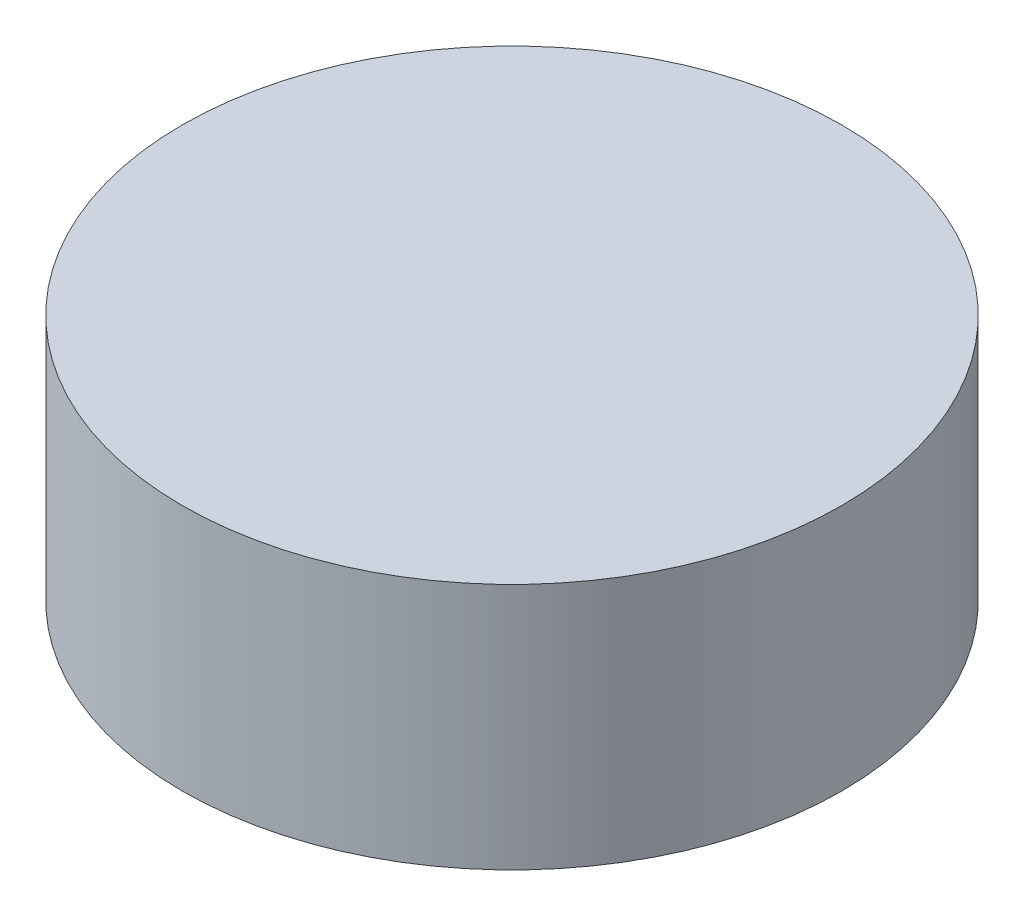
ISO-10303-21;
HEADER;
FILE_DESCRIPTION(('STEP AP214'),'2;1');
FILE_NAME('part.step','',(''),(''),'','','');
FILE_SCHEMA(('AUTOMOTIVE_DESIGN { 1 0 10303 214 1 1 1 1 }'));
ENDSEC;
DATA;
#1=APPLICATION_CONTEXT('core data for automotive mechanical design processes');
#2=APPLICATION_PROTOCOL_DEFINITION('international standard','automotive_design',2000,#1);
#3=PRODUCT_CONTEXT('',#1,'mechanical');
#4=PRODUCT('Part','Part','',(#3));
#5=PRODUCT_RELATED_PRODUCT_CATEGORY('part','',(#4));
#6=PRODUCT_DEFINITION_FORMATION('','',#4);
#7=PRODUCT_DEFINITION_CONTEXT('part definition',#1,'design');
#8=PRODUCT_DEFINITION('design','',#6,#7);
#9=PRODUCT_DEFINITION_SHAPE('','',#8);
#10=(LENGTH_UNIT() NAMED_UNIT(*) SI_UNIT(.MILLI.,.METRE.));
#11=(NAMED_UNIT(*) PLANE_ANGLE_UNIT() SI_UNIT($,.RADIAN.));
#12=(NAMED_UNIT(*) SI_UNIT($,.STERADIAN.) SOLID_ANGLE_UNIT());
#13=UNCERTAINTY_MEASURE_WITH_UNIT(LENGTH_MEASURE(1.E-05),#10,'distance_accuracy_value','');
#14=(GEOMETRIC_REPRESENTATION_CONTEXT(3) GLOBAL_UNCERTAINTY_ASSIGNED_CONTEXT((#13)) GLOBAL_UNIT_ASSIGNED_CONTEXT((#10,
#11,#12)) REPRESENTATION_CONTEXT('',''));
#15=CARTESIAN_POINT('',(0.,0.,0.));
#16=DIRECTION('',(0.,0.,1.));
#17=DIRECTION('',(1.,0.,0.));
#18=AXIS2_PLACEMENT_3D('',#15,#16,#17);
#19=CARTESIAN_POINT('',(-70.,-300.,999.189515242654));
#20=DIRECTION('',(0.,-1.,0.));
#21=DIRECTION('',(1.,0.,0.));
#22=AXIS2_PLACEMENT_3D('',#19,#20,#21);
#23=PLANE('',#22);
#24=CARTESIAN_POINT('',(-70.,-300.,999.189515242654));
#25=DIRECTION('',(0.,-1.,0.));
#26=DIRECTION('',(1.,0.,0.));
#27=AXIS2_PLACEMENT_3D('',#24,#25,#26);
#28=CIRCLE('',#27,40.);
#29=CARTESIAN_POINT('',(-30.,-300.,999.189515242654));
#30=VERTEX_POINT('',#29);
#31=EDGE_CURVE('E38',#30,#30,#28,.T.);
#32=ORIENTED_EDGE('',*,*,#31,.T.);
#33=EDGE_LOOP('',(#32));
#34=FACE_BOUND('',#33,.T.);
#35=CARTESIAN_POINT('',(-70.,-300.,999.189515242654));
#36=DIRECTION('',(0.,-1.,0.));
#37=DIRECTION('',(1.,0.,0.));
#38=AXIS2_PLACEMENT_3D('',#35,#36,#37);
#39=CIRCLE('',#38,34.);
#40=CARTESIAN_POINT('',(-36.,-300.,999.189515242654));
#41=VERTEX_POINT('',#40);
#42=EDGE_CURVE('E47',#41,#41,#39,.T.);
#43=ORIENTED_EDGE('',*,*,#42,.F.);
#44=EDGE_LOOP('',(#43));
#45=FACE_BOUND('',#44,.T.);
#46=ADVANCED_FACE('F31',(#34,#45),#23,.T.);
#47=CARTESIAN_POINT('',(-70.,-270.,999.189515242654));
#48=DIRECTION('',(0.,-1.,0.));
#49=DIRECTION('',(1.,0.,0.));
#50=AXIS2_PLACEMENT_3D('',#47,#48,#49);
#51=PLANE('',#50);
#52=CARTESIAN_POINT('',(-70.,-270.,999.189515242654));
#53=DIRECTION('',(0.,-1.,0.));
#54=DIRECTION('',(1.,0.,0.));
#55=AXIS2_PLACEMENT_3D('',#52,#53,#54);
#56=CIRCLE('',#55,40.);
#57=CARTESIAN_POINT('',(-30.,-270.,999.189515242654));
#58=VERTEX_POINT('',#57);
#59=EDGE_CURVE('E42',#58,#58,#56,.T.);
#60=ORIENTED_EDGE('',*,*,#59,.F.);
#61=EDGE_LOOP('',(#60));
#62=FACE_BOUND('',#61,.T.);
#63=ADVANCED_FACE('F55',(#62),#51,.F.);
#64=CARTESIAN_POINT('',(-70.,-300.,999.189515242654));
#65=DIRECTION('',(0.,1.,0.));
#66=DIRECTION('',(-1.,0.,0.));
#67=AXIS2_PLACEMENT_3D('',#64,#65,#66);
#68=CYLINDRICAL_SURFACE('',#67,40.);
#69=ORIENTED_EDGE('',*,*,#31,.F.);
#70=EDGE_LOOP('',(#69));
#71=FACE_BOUND('',#70,.T.);
#72=ORIENTED_EDGE('',*,*,#59,.T.);
#73=EDGE_LOOP('',(#72));
#74=FACE_BOUND('',#73,.T.);
#75=ADVANCED_FACE('F33',(#71,#74),#68,.T.);
#76=CARTESIAN_POINT('',(-70.,-300.,999.189515242654));
#77=DIRECTION('',(0.,1.,0.));
#78=DIRECTION('',(-1.,0.,0.));
#79=AXIS2_PLACEMENT_3D('',#76,#77,#78);
#80=CYLINDRICAL_SURFACE('',#79,34.);
#81=CARTESIAN_POINT('',(-70.,-298.61909592509,999.189515242654));
#82=DIRECTION('',(0.,1.,0.));
#83=DIRECTION('',(-1.,0.,0.));
#84=AXIS2_PLACEMENT_3D('',#81,#82,#83);
#85=CIRCLE('',#84,34.);
#86=CARTESIAN_POINT('',(-104.,-298.61909592509,999.189515242654));
#87=VERTEX_POINT('',#86);
#88=EDGE_CURVE('E10',#87,#87,#85,.F.);
#89=ORIENTED_EDGE('',*,*,#88,.F.);
#90=EDGE_LOOP('',(#89));
#91=FACE_BOUND('',#90,.T.);
#92=ORIENTED_EDGE('',*,*,#42,.T.);
#93=EDGE_LOOP('',(#92));
#94=FACE_BOUND('',#93,.T.);
#95=ADVANCED_FACE('F52',(#91,#94),#80,.F.);
#96=CARTESIAN_POINT('',(-70.,-193.892654452949,999.189515242654));
#97=DIRECTION('',(0.,1.,0.));
#98=DIRECTION('',(-1.,0.,0.));
#99=AXIS2_PLACEMENT_3D('',#96,#97,#98);
#100=SPHERICAL_SURFACE('',#99,110.107345547051);
#101=ORIENTED_EDGE('',*,*,#88,.T.);
#102=EDGE_LOOP('',(#101));
#103=FACE_BOUND('',#102,.T.);
#104=ADVANCED_FACE('F64',(#103),#100,.T.);
#105=CLOSED_SHELL('',(#46,#63,#75,#95,#104));
#106=MANIFOLD_SOLID_BREP('B2',#105);
#107=ADVANCED_BREP_SHAPE_REPRESENTATION('',(#18,#106),#14);
#108=SHAPE_DEFINITION_REPRESENTATION(#9,#107);
ENDSEC;
END-ISO-10303-21;
